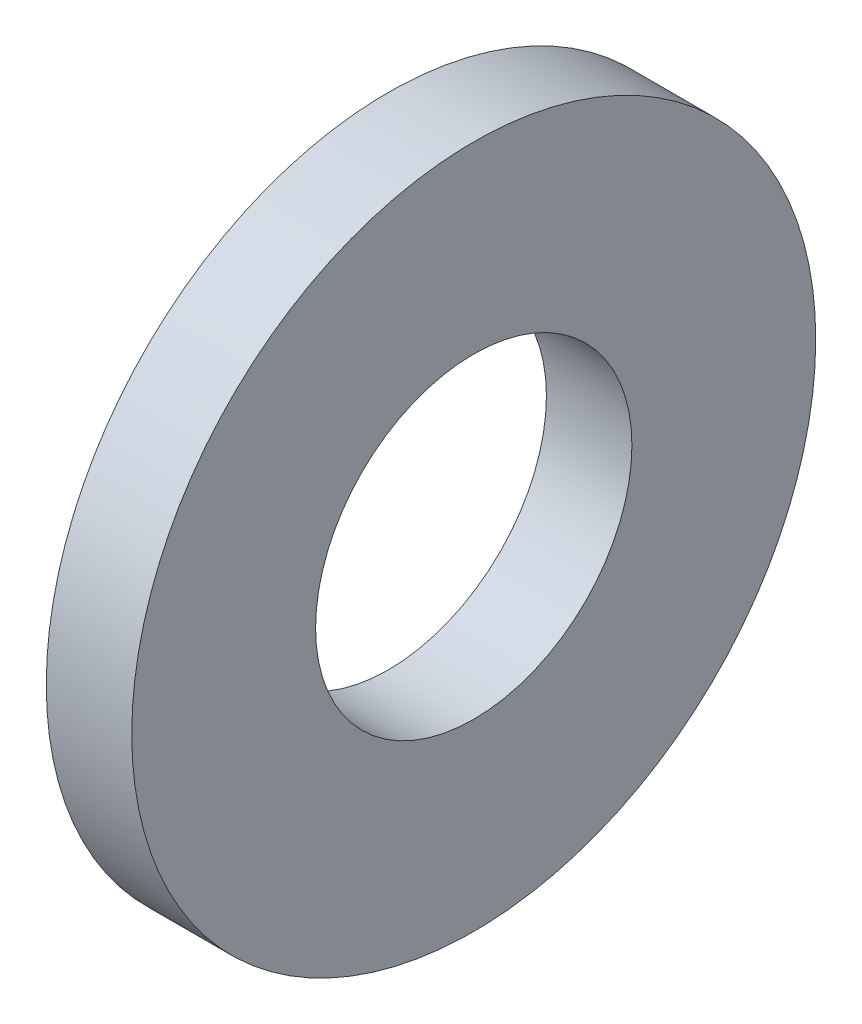
ISO-10303-21;
HEADER;
FILE_DESCRIPTION(('STEP AP214'),'2;1');
FILE_NAME('part.step','',(''),(''),'','','');
FILE_SCHEMA(('AUTOMOTIVE_DESIGN { 1 0 10303 214 1 1 1 1 }'));
ENDSEC;
DATA;
#1=APPLICATION_CONTEXT('core data for automotive mechanical design processes');
#2=APPLICATION_PROTOCOL_DEFINITION('international standard','automotive_design',2000,#1);
#3=PRODUCT_CONTEXT('',#1,'mechanical');
#4=PRODUCT('Part','Part','',(#3));
#5=PRODUCT_RELATED_PRODUCT_CATEGORY('part','',(#4));
#6=PRODUCT_DEFINITION_FORMATION('','',#4);
#7=PRODUCT_DEFINITION_CONTEXT('part definition',#1,'design');
#8=PRODUCT_DEFINITION('design','',#6,#7);
#9=PRODUCT_DEFINITION_SHAPE('','',#8);
#10=(LENGTH_UNIT() NAMED_UNIT(*) SI_UNIT(.MILLI.,.METRE.));
#11=(NAMED_UNIT(*) PLANE_ANGLE_UNIT() SI_UNIT($,.RADIAN.));
#12=(NAMED_UNIT(*) SI_UNIT($,.STERADIAN.) SOLID_ANGLE_UNIT());
#13=UNCERTAINTY_MEASURE_WITH_UNIT(LENGTH_MEASURE(1.E-05),#10,'distance_accuracy_value','');
#14=(GEOMETRIC_REPRESENTATION_CONTEXT(3) GLOBAL_UNCERTAINTY_ASSIGNED_CONTEXT((#13)) GLOBAL_UNIT_ASSIGNED_CONTEXT((#10,
#11,#12)) REPRESENTATION_CONTEXT('',''));
#15=CARTESIAN_POINT('',(0.,0.,0.));
#16=DIRECTION('',(0.,0.,1.));
#17=DIRECTION('',(1.,0.,0.));
#18=AXIS2_PLACEMENT_3D('',#15,#16,#17);
#19=CARTESIAN_POINT('',(2.,0.,0.));
#20=DIRECTION('',(1.,0.,0.));
#21=DIRECTION('',(0.,0.,-1.));
#22=AXIS2_PLACEMENT_3D('',#19,#20,#21);
#23=PLANE('',#22);
#24=CARTESIAN_POINT('',(2.,0.,0.));
#25=DIRECTION('',(1.,0.,0.));
#26=DIRECTION('',(0.,0.,-1.));
#27=AXIS2_PLACEMENT_3D('',#24,#25,#26);
#28=CIRCLE('',#27,8.);
#29=CARTESIAN_POINT('',(2.,0.,-8.));
#30=VERTEX_POINT('',#29);
#31=EDGE_CURVE('E10',#30,#30,#28,.T.);
#32=ORIENTED_EDGE('',*,*,#31,.T.);
#33=EDGE_LOOP('',(#32));
#34=FACE_BOUND('',#33,.T.);
#35=CARTESIAN_POINT('',(2.,0.,0.));
#36=DIRECTION('',(1.,0.,0.));
#37=DIRECTION('',(0.,0.,-1.));
#38=AXIS2_PLACEMENT_3D('',#35,#36,#37);
#39=CIRCLE('',#38,3.7);
#40=CARTESIAN_POINT('',(2.,0.,-3.7));
#41=VERTEX_POINT('',#40);
#42=EDGE_CURVE('E41',#41,#41,#39,.T.);
#43=ORIENTED_EDGE('',*,*,#42,.F.);
#44=EDGE_LOOP('',(#43));
#45=FACE_BOUND('',#44,.T.);
#46=ADVANCED_FACE('F30',(#34,#45),#23,.T.);
#47=CARTESIAN_POINT('',(0.,0.,0.));
#48=DIRECTION('',(1.,0.,0.));
#49=DIRECTION('',(0.,0.,-1.));
#50=AXIS2_PLACEMENT_3D('',#47,#48,#49);
#51=PLANE('',#50);
#52=CARTESIAN_POINT('',(0.,0.,0.));
#53=DIRECTION('',(1.,0.,0.));
#54=DIRECTION('',(0.,0.,-1.));
#55=AXIS2_PLACEMENT_3D('',#52,#53,#54);
#56=CIRCLE('',#55,8.);
#57=CARTESIAN_POINT('',(0.,0.,-8.));
#58=VERTEX_POINT('',#57);
#59=EDGE_CURVE('E34',#58,#58,#56,.T.);
#60=ORIENTED_EDGE('',*,*,#59,.F.);
#61=EDGE_LOOP('',(#60));
#62=FACE_BOUND('',#61,.T.);
#63=CARTESIAN_POINT('',(0.,0.,0.));
#64=DIRECTION('',(1.,0.,0.));
#65=DIRECTION('',(0.,0.,-1.));
#66=AXIS2_PLACEMENT_3D('',#63,#64,#65);
#67=CIRCLE('',#66,3.7);
#68=CARTESIAN_POINT('',(0.,0.,-3.7));
#69=VERTEX_POINT('',#68);
#70=EDGE_CURVE('E43',#69,#69,#67,.T.);
#71=ORIENTED_EDGE('',*,*,#70,.T.);
#72=EDGE_LOOP('',(#71));
#73=FACE_BOUND('',#72,.T.);
#74=ADVANCED_FACE('F53',(#62,#73),#51,.F.);
#75=CARTESIAN_POINT('',(2.,0.,0.));
#76=DIRECTION('',(-1.,0.,0.));
#77=DIRECTION('',(0.,0.,1.));
#78=AXIS2_PLACEMENT_3D('',#75,#76,#77);
#79=CYLINDRICAL_SURFACE('',#78,8.);
#80=ORIENTED_EDGE('',*,*,#31,.F.);
#81=EDGE_LOOP('',(#80));
#82=FACE_BOUND('',#81,.T.);
#83=ORIENTED_EDGE('',*,*,#59,.T.);
#84=EDGE_LOOP('',(#83));
#85=FACE_BOUND('',#84,.T.);
#86=ADVANCED_FACE('F32',(#82,#85),#79,.T.);
#87=CARTESIAN_POINT('',(2.,0.,0.));
#88=DIRECTION('',(-1.,0.,0.));
#89=DIRECTION('',(0.,0.,1.));
#90=AXIS2_PLACEMENT_3D('',#87,#88,#89);
#91=CYLINDRICAL_SURFACE('',#90,3.7);
#92=ORIENTED_EDGE('',*,*,#42,.T.);
#93=EDGE_LOOP('',(#92));
#94=FACE_BOUND('',#93,.T.);
#95=ORIENTED_EDGE('',*,*,#70,.F.);
#96=EDGE_LOOP('',(#95));
#97=FACE_BOUND('',#96,.T.);
#98=ADVANCED_FACE('F49',(#94,#97),#91,.F.);
#99=CLOSED_SHELL('',(#46,#74,#86,#98));
#100=MANIFOLD_SOLID_BREP('B2',#99);
#101=ADVANCED_BREP_SHAPE_REPRESENTATION('',(#18,#100),#14);
#102=SHAPE_DEFINITION_REPRESENTATION(#9,#101);
ENDSEC;
END-ISO-10303-21;
